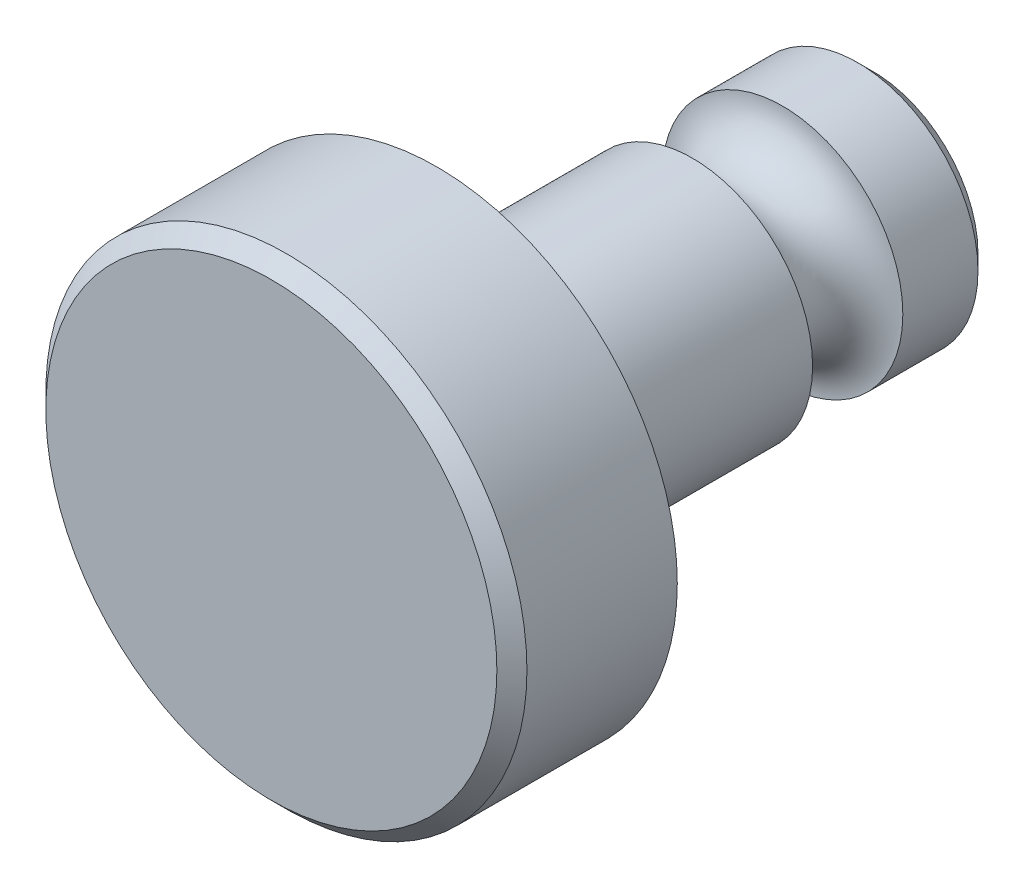
ISO-10303-21;
HEADER;
FILE_DESCRIPTION(('STEP AP214'),'2;1');
FILE_NAME('part.step','',(''),(''),'','','');
FILE_SCHEMA(('AUTOMOTIVE_DESIGN { 1 0 10303 214 1 1 1 1 }'));
ENDSEC;
DATA;
#1=APPLICATION_CONTEXT('core data for automotive mechanical design processes');
#2=APPLICATION_PROTOCOL_DEFINITION('international standard','automotive_design',2000,#1);
#3=PRODUCT_CONTEXT('',#1,'mechanical');
#4=PRODUCT('Part','Part','',(#3));
#5=PRODUCT_RELATED_PRODUCT_CATEGORY('part','',(#4));
#6=PRODUCT_DEFINITION_FORMATION('','',#4);
#7=PRODUCT_DEFINITION_CONTEXT('part definition',#1,'design');
#8=PRODUCT_DEFINITION('design','',#6,#7);
#9=PRODUCT_DEFINITION_SHAPE('','',#8);
#10=(LENGTH_UNIT() NAMED_UNIT(*) SI_UNIT(.MILLI.,.METRE.));
#11=(NAMED_UNIT(*) PLANE_ANGLE_UNIT() SI_UNIT($,.RADIAN.));
#12=(NAMED_UNIT(*) SI_UNIT($,.STERADIAN.) SOLID_ANGLE_UNIT());
#13=UNCERTAINTY_MEASURE_WITH_UNIT(LENGTH_MEASURE(1.E-05),#10,'distance_accuracy_value','');
#14=(GEOMETRIC_REPRESENTATION_CONTEXT(3) GLOBAL_UNCERTAINTY_ASSIGNED_CONTEXT((#13)) GLOBAL_UNIT_ASSIGNED_CONTEXT((#10,
#11,#12)) REPRESENTATION_CONTEXT('',''));
#15=CARTESIAN_POINT('',(0.,0.,0.));
#16=DIRECTION('',(0.,0.,1.));
#17=DIRECTION('',(1.,0.,0.));
#18=AXIS2_PLACEMENT_3D('',#15,#16,#17);
#19=CARTESIAN_POINT('',(0.,0.,-20.));
#20=DIRECTION('',(0.,0.,-1.));
#21=DIRECTION('',(-1.,0.,0.));
#22=AXIS2_PLACEMENT_3D('',#19,#20,#21);
#23=PLANE('',#22);
#24=CARTESIAN_POINT('',(0.,0.,-20.));
#25=DIRECTION('',(0.,0.,-1.));
#26=DIRECTION('',(-1.,0.,0.));
#27=AXIS2_PLACEMENT_3D('',#24,#25,#26);
#28=CIRCLE('',#27,3.49999999999999);
#29=CARTESIAN_POINT('',(-3.49999999999999,0.,-20.));
#30=VERTEX_POINT('',#29);
#31=EDGE_CURVE('E10',#30,#30,#28,.T.);
#32=ORIENTED_EDGE('',*,*,#31,.T.);
#33=EDGE_LOOP('',(#32));
#34=FACE_BOUND('',#33,.T.);
#35=ADVANCED_FACE('F37',(#34),#23,.T.);
#36=CARTESIAN_POINT('',(0.,0.,-5.5));
#37=DIRECTION('',(0.,0.,1.));
#38=DIRECTION('',(1.,0.,0.));
#39=AXIS2_PLACEMENT_3D('',#36,#37,#38);
#40=CYLINDRICAL_SURFACE('',#39,4.);
#41=CARTESIAN_POINT('',(0.,0.,-19.5));
#42=DIRECTION('',(0.,0.,-1.));
#43=DIRECTION('',(-1.,0.,0.));
#44=AXIS2_PLACEMENT_3D('',#41,#42,#43);
#45=CIRCLE('',#44,4.);
#46=CARTESIAN_POINT('',(-4.,0.,-19.5));
#47=VERTEX_POINT('',#46);
#48=EDGE_CURVE('E45',#47,#47,#45,.F.);
#49=ORIENTED_EDGE('',*,*,#48,.T.);
#50=EDGE_LOOP('',(#49));
#51=FACE_BOUND('',#50,.T.);
#52=CARTESIAN_POINT('',(0.,0.,-17.));
#53=DIRECTION('',(0.,0.,1.));
#54=DIRECTION('',(1.,0.,0.));
#55=AXIS2_PLACEMENT_3D('',#52,#53,#54);
#56=CIRCLE('',#55,4.);
#57=CARTESIAN_POINT('',(4.,0.,-17.));
#58=VERTEX_POINT('',#57);
#59=EDGE_CURVE('E61',#58,#58,#56,.T.);
#60=ORIENTED_EDGE('',*,*,#59,.F.);
#61=EDGE_LOOP('',(#60));
#62=FACE_BOUND('',#61,.T.);
#63=ADVANCED_FACE('F91',(#51,#62),#40,.T.);
#64=CARTESIAN_POINT('',(0.,0.,-15.5));
#65=DIRECTION('',(0.,0.,1.));
#66=DIRECTION('',(1.,0.,0.));
#67=AXIS2_PLACEMENT_3D('',#64,#65,#66);
#68=TOROIDAL_SURFACE('',#67,4.,1.5);
#69=ORIENTED_EDGE('',*,*,#59,.T.);
#70=EDGE_LOOP('',(#69));
#71=FACE_BOUND('',#70,.T.);
#72=CARTESIAN_POINT('',(0.,0.,-14.));
#73=DIRECTION('',(0.,0.,1.));
#74=DIRECTION('',(1.,0.,0.));
#75=AXIS2_PLACEMENT_3D('',#72,#73,#74);
#76=CIRCLE('',#75,4.);
#77=CARTESIAN_POINT('',(4.,0.,-14.));
#78=VERTEX_POINT('',#77);
#79=EDGE_CURVE('E65',#78,#78,#76,.T.);
#80=ORIENTED_EDGE('',*,*,#79,.F.);
#81=EDGE_LOOP('',(#80));
#82=FACE_BOUND('',#81,.T.);
#83=ADVANCED_FACE('F88',(#71,#82),#68,.F.);
#84=ORIENTED_EDGE('',*,*,#79,.T.);
#85=EDGE_LOOP('',(#84));
#86=FACE_BOUND('',#85,.T.);
#87=CARTESIAN_POINT('',(0.,0.,-5.5));
#88=DIRECTION('',(0.,0.,1.));
#89=DIRECTION('',(1.,0.,0.));
#90=AXIS2_PLACEMENT_3D('',#87,#88,#89);
#91=CIRCLE('',#90,4.);
#92=CARTESIAN_POINT('',(4.,0.,-5.5));
#93=VERTEX_POINT('',#92);
#94=EDGE_CURVE('E69',#93,#93,#91,.T.);
#95=ORIENTED_EDGE('',*,*,#94,.F.);
#96=EDGE_LOOP('',(#95));
#97=FACE_BOUND('',#96,.T.);
#98=ADVANCED_FACE('F83',(#86,#97),#40,.T.);
#99=CARTESIAN_POINT('',(0.,0.,-5.5));
#100=DIRECTION('',(0.,0.,1.));
#101=DIRECTION('',(1.,0.,0.));
#102=AXIS2_PLACEMENT_3D('',#99,#100,#101);
#103=PLANE('',#102);
#104=CARTESIAN_POINT('',(0.,0.,-5.5));
#105=DIRECTION('',(0.,0.,1.));
#106=DIRECTION('',(1.,0.,0.));
#107=AXIS2_PLACEMENT_3D('',#104,#105,#106);
#108=CIRCLE('',#107,8.);
#109=CARTESIAN_POINT('',(8.,0.,-5.5));
#110=VERTEX_POINT('',#109);
#111=EDGE_CURVE('E73',#110,#110,#108,.T.);
#112=ORIENTED_EDGE('',*,*,#111,.F.);
#113=EDGE_LOOP('',(#112));
#114=FACE_BOUND('',#113,.T.);
#115=ORIENTED_EDGE('',*,*,#94,.T.);
#116=EDGE_LOOP('',(#115));
#117=FACE_BOUND('',#116,.T.);
#118=ADVANCED_FACE('F80',(#114,#117),#103,.F.);
#119=CARTESIAN_POINT('',(0.,0.,-5.5));
#120=DIRECTION('',(0.,0.,1.));
#121=DIRECTION('',(1.,0.,0.));
#122=AXIS2_PLACEMENT_3D('',#119,#120,#121);
#123=CYLINDRICAL_SURFACE('',#122,8.);
#124=CARTESIAN_POINT('',(0.,0.,-0.500000000000004));
#125=DIRECTION('',(0.,0.,1.));
#126=DIRECTION('',(1.,0.,0.));
#127=AXIS2_PLACEMENT_3D('',#124,#125,#126);
#128=CIRCLE('',#127,8.);
#129=CARTESIAN_POINT('',(8.,0.,-0.500000000000004));
#130=VERTEX_POINT('',#129);
#131=EDGE_CURVE('E50',#130,#130,#128,.F.);
#132=ORIENTED_EDGE('',*,*,#131,.T.);
#133=EDGE_LOOP('',(#132));
#134=FACE_BOUND('',#133,.T.);
#135=ORIENTED_EDGE('',*,*,#111,.T.);
#136=EDGE_LOOP('',(#135));
#137=FACE_BOUND('',#136,.T.);
#138=ADVANCED_FACE('F78',(#134,#137),#123,.T.);
#139=CARTESIAN_POINT('',(0.,0.,0.));
#140=DIRECTION('',(0.,0.,1.));
#141=DIRECTION('',(1.,0.,0.));
#142=AXIS2_PLACEMENT_3D('',#139,#140,#141);
#143=PLANE('',#142);
#144=CARTESIAN_POINT('',(0.,0.,0.));
#145=DIRECTION('',(0.,0.,1.));
#146=DIRECTION('',(1.,0.,0.));
#147=AXIS2_PLACEMENT_3D('',#144,#145,#146);
#148=CIRCLE('',#147,7.5);
#149=CARTESIAN_POINT('',(7.5,0.,0.));
#150=VERTEX_POINT('',#149);
#151=EDGE_CURVE('E55',#150,#150,#148,.T.);
#152=ORIENTED_EDGE('',*,*,#151,.T.);
#153=EDGE_LOOP('',(#152));
#154=FACE_BOUND('',#153,.T.);
#155=ADVANCED_FACE('F104',(#154),#143,.T.);
#156=CARTESIAN_POINT('',(0.,0.,0.));
#157=DIRECTION('',(0.,0.,-1.));
#158=DIRECTION('',(-1.,0.,0.));
#159=AXIS2_PLACEMENT_3D('',#156,#157,#158);
#160=CONICAL_SURFACE('',#159,7.5,0.785398163397445);
#161=ORIENTED_EDGE('',*,*,#131,.F.);
#162=EDGE_LOOP('',(#161));
#163=FACE_BOUND('',#162,.T.);
#164=ORIENTED_EDGE('',*,*,#151,.F.);
#165=EDGE_LOOP('',(#164));
#166=FACE_BOUND('',#165,.T.);
#167=ADVANCED_FACE('F102',(#163,#166),#160,.T.);
#168=CARTESIAN_POINT('',(0.,0.,-19.5));
#169=DIRECTION('',(0.,0.,1.));
#170=DIRECTION('',(1.,0.,0.));
#171=AXIS2_PLACEMENT_3D('',#168,#169,#170);
#172=CONICAL_SURFACE('',#171,4.,0.785398163397452);
#173=ORIENTED_EDGE('',*,*,#31,.F.);
#174=EDGE_LOOP('',(#173));
#175=FACE_BOUND('',#174,.T.);
#176=ORIENTED_EDGE('',*,*,#48,.F.);
#177=EDGE_LOOP('',(#176));
#178=FACE_BOUND('',#177,.T.);
#179=ADVANCED_FACE('F39',(#175,#178),#172,.T.);
#180=CLOSED_SHELL('',(#35,#63,#83,#98,#118,#138,#155,#167,#179));
#181=MANIFOLD_SOLID_BREP('B2',#180);
#182=ADVANCED_BREP_SHAPE_REPRESENTATION('',(#18,#181),#14);
#183=SHAPE_DEFINITION_REPRESENTATION(#9,#182);
ENDSEC;
END-ISO-10303-21;
